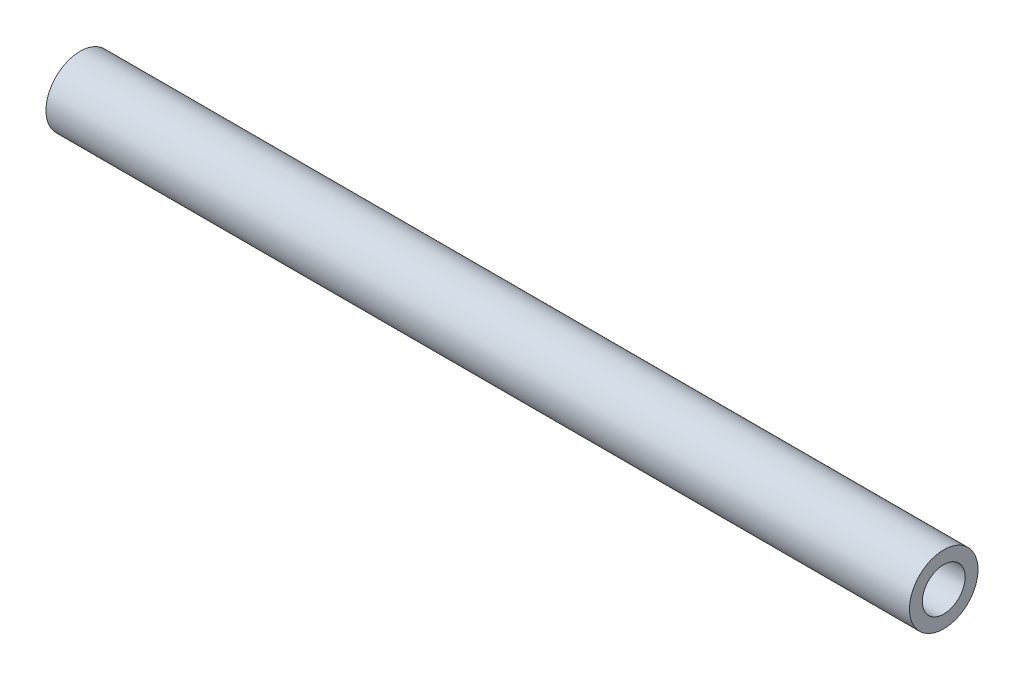
ISO-10303-21;
HEADER;
FILE_DESCRIPTION(('STEP AP214'),'2;1');
FILE_NAME('part.step','',(''),(''),'','','');
FILE_SCHEMA(('AUTOMOTIVE_DESIGN { 1 0 10303 214 1 1 1 1 }'));
ENDSEC;
DATA;
#1=APPLICATION_CONTEXT('core data for automotive mechanical design processes');
#2=APPLICATION_PROTOCOL_DEFINITION('international standard','automotive_design',2000,#1);
#3=PRODUCT_CONTEXT('',#1,'mechanical');
#4=PRODUCT('Part','Part','',(#3));
#5=PRODUCT_RELATED_PRODUCT_CATEGORY('part','',(#4));
#6=PRODUCT_DEFINITION_FORMATION('','',#4);
#7=PRODUCT_DEFINITION_CONTEXT('part definition',#1,'design');
#8=PRODUCT_DEFINITION('design','',#6,#7);
#9=PRODUCT_DEFINITION_SHAPE('','',#8);
#10=(LENGTH_UNIT() NAMED_UNIT(*) SI_UNIT(.MILLI.,.METRE.));
#11=(NAMED_UNIT(*) PLANE_ANGLE_UNIT() SI_UNIT($,.RADIAN.));
#12=(NAMED_UNIT(*) SI_UNIT($,.STERADIAN.) SOLID_ANGLE_UNIT());
#13=UNCERTAINTY_MEASURE_WITH_UNIT(LENGTH_MEASURE(1.E-05),#10,'distance_accuracy_value','');
#14=(GEOMETRIC_REPRESENTATION_CONTEXT(3) GLOBAL_UNCERTAINTY_ASSIGNED_CONTEXT((#13)) GLOBAL_UNIT_ASSIGNED_CONTEXT((#10,
#11,#12)) REPRESENTATION_CONTEXT('',''));
#15=CARTESIAN_POINT('',(0.,0.,0.));
#16=DIRECTION('',(0.,0.,1.));
#17=DIRECTION('',(1.,0.,0.));
#18=AXIS2_PLACEMENT_3D('',#15,#16,#17);
#19=CARTESIAN_POINT('',(80.01,0.,0.));
#20=DIRECTION('',(-1.,0.,0.));
#21=DIRECTION('',(0.,0.,1.));
#22=AXIS2_PLACEMENT_3D('',#19,#20,#21);
#23=CYLINDRICAL_SURFACE('',#22,3.175);
#24=CARTESIAN_POINT('',(80.01,0.,0.));
#25=DIRECTION('',(1.,0.,0.));
#26=DIRECTION('',(0.,0.,-1.));
#27=AXIS2_PLACEMENT_3D('',#24,#25,#26);
#28=CIRCLE('',#27,3.175);
#29=CARTESIAN_POINT('',(80.01,0.,-3.175));
#30=VERTEX_POINT('',#29);
#31=EDGE_CURVE('E10',#30,#30,#28,.T.);
#32=ORIENTED_EDGE('',*,*,#31,.F.);
#33=EDGE_LOOP('',(#32));
#34=FACE_BOUND('',#33,.T.);
#35=CARTESIAN_POINT('',(0.,0.,0.));
#36=DIRECTION('',(1.,0.,0.));
#37=DIRECTION('',(0.,0.,-1.));
#38=AXIS2_PLACEMENT_3D('',#35,#36,#37);
#39=CIRCLE('',#38,3.175);
#40=CARTESIAN_POINT('',(0.,0.,-3.175));
#41=VERTEX_POINT('',#40);
#42=EDGE_CURVE('E33',#41,#41,#39,.T.);
#43=ORIENTED_EDGE('',*,*,#42,.T.);
#44=EDGE_LOOP('',(#43));
#45=FACE_BOUND('',#44,.T.);
#46=ADVANCED_FACE('F30',(#34,#45),#23,.T.);
#47=CARTESIAN_POINT('',(80.01,0.,0.));
#48=DIRECTION('',(1.,0.,0.));
#49=DIRECTION('',(0.,0.,-1.));
#50=AXIS2_PLACEMENT_3D('',#47,#48,#49);
#51=PLANE('',#50);
#52=CARTESIAN_POINT('',(80.01,0.,0.));
#53=DIRECTION('',(-1.,0.,0.));
#54=DIRECTION('',(0.,0.,1.));
#55=AXIS2_PLACEMENT_3D('',#52,#53,#54);
#56=CIRCLE('',#55,1.98437499999998);
#57=CARTESIAN_POINT('',(80.01,0.,1.98437499999998));
#58=VERTEX_POINT('',#57);
#59=EDGE_CURVE('E40',#58,#58,#56,.T.);
#60=ORIENTED_EDGE('',*,*,#59,.T.);
#61=EDGE_LOOP('',(#60));
#62=FACE_BOUND('',#61,.T.);
#63=ORIENTED_EDGE('',*,*,#31,.T.);
#64=EDGE_LOOP('',(#63));
#65=FACE_BOUND('',#64,.T.);
#66=ADVANCED_FACE('F53',(#62,#65),#51,.T.);
#67=CARTESIAN_POINT('',(0.,0.,0.));
#68=DIRECTION('',(1.,0.,0.));
#69=DIRECTION('',(0.,0.,-1.));
#70=AXIS2_PLACEMENT_3D('',#67,#68,#69);
#71=PLANE('',#70);
#72=CARTESIAN_POINT('',(0.,0.,0.));
#73=DIRECTION('',(-1.,0.,0.));
#74=DIRECTION('',(0.,0.,1.));
#75=AXIS2_PLACEMENT_3D('',#72,#73,#74);
#76=CIRCLE('',#75,1.98437499999999);
#77=CARTESIAN_POINT('',(0.,0.,1.98437499999999));
#78=VERTEX_POINT('',#77);
#79=EDGE_CURVE('E44',#78,#78,#76,.T.);
#80=ORIENTED_EDGE('',*,*,#79,.F.);
#81=EDGE_LOOP('',(#80));
#82=FACE_BOUND('',#81,.T.);
#83=ORIENTED_EDGE('',*,*,#42,.F.);
#84=EDGE_LOOP('',(#83));
#85=FACE_BOUND('',#84,.T.);
#86=ADVANCED_FACE('F50',(#82,#85),#71,.F.);
#87=CARTESIAN_POINT('',(0.,0.,0.));
#88=DIRECTION('',(-1.,0.,0.));
#89=DIRECTION('',(0.,0.,1.));
#90=AXIS2_PLACEMENT_3D('',#87,#88,#89);
#91=CYLINDRICAL_SURFACE('',#90,1.98437499999999);
#92=ORIENTED_EDGE('',*,*,#59,.F.);
#93=EDGE_LOOP('',(#92));
#94=FACE_BOUND('',#93,.T.);
#95=ORIENTED_EDGE('',*,*,#79,.T.);
#96=EDGE_LOOP('',(#95));
#97=FACE_BOUND('',#96,.T.);
#98=ADVANCED_FACE('F48',(#94,#97),#91,.F.);
#99=CLOSED_SHELL('',(#46,#66,#86,#98));
#100=MANIFOLD_SOLID_BREP('B2',#99);
#101=ADVANCED_BREP_SHAPE_REPRESENTATION('',(#18,#100),#14);
#102=SHAPE_DEFINITION_REPRESENTATION(#9,#101);
ENDSEC;
END-ISO-10303-21;
